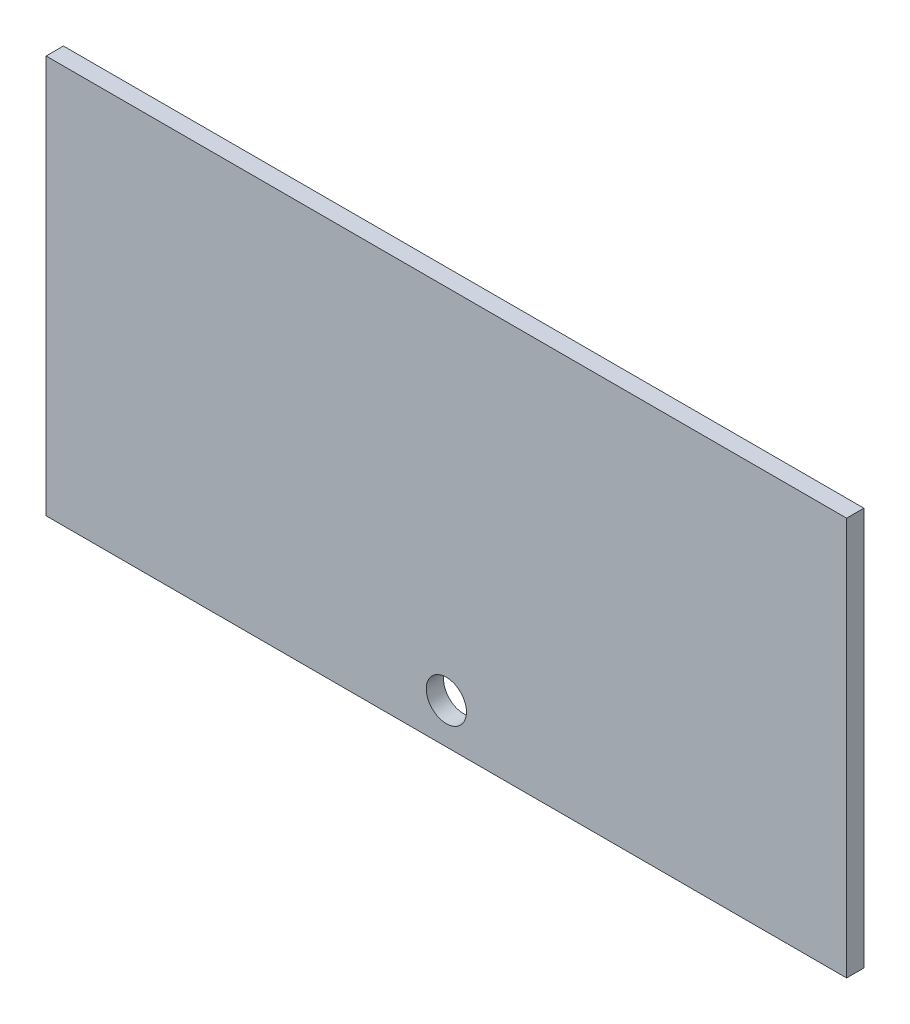
ISO-10303-21;
HEADER;
FILE_DESCRIPTION(('STEP AP214'),'2;1');
FILE_NAME('part.step','',(''),(''),'','','');
FILE_SCHEMA(('AUTOMOTIVE_DESIGN { 1 0 10303 214 1 1 1 1 }'));
ENDSEC;
DATA;
#1=APPLICATION_CONTEXT('core data for automotive mechanical design processes');
#2=APPLICATION_PROTOCOL_DEFINITION('international standard','automotive_design',2000,#1);
#3=PRODUCT_CONTEXT('',#1,'mechanical');
#4=PRODUCT('Part','Part','',(#3));
#5=PRODUCT_RELATED_PRODUCT_CATEGORY('part','',(#4));
#6=PRODUCT_DEFINITION_FORMATION('','',#4);
#7=PRODUCT_DEFINITION_CONTEXT('part definition',#1,'design');
#8=PRODUCT_DEFINITION('design','',#6,#7);
#9=PRODUCT_DEFINITION_SHAPE('','',#8);
#10=(LENGTH_UNIT() NAMED_UNIT(*) SI_UNIT(.MILLI.,.METRE.));
#11=(NAMED_UNIT(*) PLANE_ANGLE_UNIT() SI_UNIT($,.RADIAN.));
#12=(NAMED_UNIT(*) SI_UNIT($,.STERADIAN.) SOLID_ANGLE_UNIT());
#13=UNCERTAINTY_MEASURE_WITH_UNIT(LENGTH_MEASURE(1.E-05),#10,'distance_accuracy_value','');
#14=(GEOMETRIC_REPRESENTATION_CONTEXT(3) GLOBAL_UNCERTAINTY_ASSIGNED_CONTEXT((#13)) GLOBAL_UNIT_ASSIGNED_CONTEXT((#10,
#11,#12)) REPRESENTATION_CONTEXT('',''));
#15=CARTESIAN_POINT('',(0.,0.,0.));
#16=DIRECTION('',(0.,0.,1.));
#17=DIRECTION('',(1.,0.,0.));
#18=AXIS2_PLACEMENT_3D('',#15,#16,#17);
#19=CARTESIAN_POINT('',(0.,0.,0.));
#20=DIRECTION('',(0.,0.,1.));
#21=DIRECTION('',(1.,0.,0.));
#22=AXIS2_PLACEMENT_3D('',#19,#20,#21);
#23=PLANE('',#22);
#24=CARTESIAN_POINT('',(0.,-197.5,0.));
#25=DIRECTION('',(0.,0.,1.));
#26=DIRECTION('',(-1.,0.,0.));
#27=AXIS2_PLACEMENT_3D('',#24,#25,#26);
#28=CIRCLE('',#27,25.);
#29=CARTESIAN_POINT('',(25.,-197.5,0.));
#30=VERTEX_POINT('',#29);
#31=EDGE_CURVE('E71',#30,#30,#28,.T.);
#32=ORIENTED_EDGE('',*,*,#31,.T.);
#33=EDGE_LOOP('',(#32));
#34=FACE_BOUND('',#33,.T.);
#35=DIRECTION('',(1.,0.,0.));
#36=VECTOR('',#35,1.);
#37=CARTESIAN_POINT('',(-497.5,247.5,0.));
#38=LINE('',#37,#36);
#39=CARTESIAN_POINT('',(-497.5,247.5,0.));
#40=VERTEX_POINT('',#39);
#41=CARTESIAN_POINT('',(497.5,247.5,0.));
#42=VERTEX_POINT('',#41);
#43=EDGE_CURVE('E11',#40,#42,#38,.T.);
#44=ORIENTED_EDGE('',*,*,#43,.T.);
#45=DIRECTION('',(0.,-1.,0.));
#46=VECTOR('',#45,1.);
#47=CARTESIAN_POINT('',(497.5,247.5,0.));
#48=LINE('',#47,#46);
#49=CARTESIAN_POINT('',(497.5,-247.5,0.));
#50=VERTEX_POINT('',#49);
#51=EDGE_CURVE('E76',#42,#50,#48,.T.);
#52=ORIENTED_EDGE('',*,*,#51,.T.);
#53=DIRECTION('',(-1.,0.,0.));
#54=VECTOR('',#53,1.);
#55=CARTESIAN_POINT('',(497.5,-247.5,0.));
#56=LINE('',#55,#54);
#57=CARTESIAN_POINT('',(-497.5,-247.5,0.));
#58=VERTEX_POINT('',#57);
#59=EDGE_CURVE('E94',#50,#58,#56,.T.);
#60=ORIENTED_EDGE('',*,*,#59,.T.);
#61=DIRECTION('',(0.,1.,0.));
#62=VECTOR('',#61,1.);
#63=CARTESIAN_POINT('',(-497.5,-247.5,0.));
#64=LINE('',#63,#62);
#65=EDGE_CURVE('E97',#58,#40,#64,.T.);
#66=ORIENTED_EDGE('',*,*,#65,.T.);
#67=EDGE_LOOP('',(#44,#52,#60,#66));
#68=FACE_BOUND('',#67,.T.);
#69=ADVANCED_FACE('F17',(#34,#68),#23,.F.);
#70=CARTESIAN_POINT('',(497.5,247.5,0.));
#71=DIRECTION('',(0.,1.,0.));
#72=DIRECTION('',(1.,0.,0.));
#73=AXIS2_PLACEMENT_3D('',#70,#71,#72);
#74=PLANE('',#73);
#75=ORIENTED_EDGE('',*,*,#43,.F.);
#76=DIRECTION('',(0.,0.,1.));
#77=VECTOR('',#76,1.);
#78=CARTESIAN_POINT('',(-497.5,247.5,0.));
#79=LINE('',#78,#77);
#80=CARTESIAN_POINT('',(-497.5,247.5,21.5));
#81=VERTEX_POINT('',#80);
#82=EDGE_CURVE('E28',#40,#81,#79,.T.);
#83=ORIENTED_EDGE('',*,*,#82,.T.);
#84=DIRECTION('',(-1.,0.,0.));
#85=VECTOR('',#84,1.);
#86=CARTESIAN_POINT('',(497.5,247.5,21.5));
#87=LINE('',#86,#85);
#88=CARTESIAN_POINT('',(497.5,247.5,21.5));
#89=VERTEX_POINT('',#88);
#90=EDGE_CURVE('E21',#89,#81,#87,.T.);
#91=ORIENTED_EDGE('',*,*,#90,.F.);
#92=DIRECTION('',(0.,0.,1.));
#93=VECTOR('',#92,1.);
#94=CARTESIAN_POINT('',(497.5,247.5,0.));
#95=LINE('',#94,#93);
#96=EDGE_CURVE('E85',#42,#89,#95,.T.);
#97=ORIENTED_EDGE('',*,*,#96,.F.);
#98=EDGE_LOOP('',(#75,#83,#91,#97));
#99=FACE_BOUND('',#98,.T.);
#100=ADVANCED_FACE('F142',(#99),#74,.T.);
#101=CARTESIAN_POINT('',(-497.5,247.5,0.));
#102=DIRECTION('',(-1.,0.,0.));
#103=DIRECTION('',(0.,0.,1.));
#104=AXIS2_PLACEMENT_3D('',#101,#102,#103);
#105=PLANE('',#104);
#106=ORIENTED_EDGE('',*,*,#65,.F.);
#107=DIRECTION('',(0.,0.,1.));
#108=VECTOR('',#107,1.);
#109=CARTESIAN_POINT('',(-497.5,-247.5,0.));
#110=LINE('',#109,#108);
#111=CARTESIAN_POINT('',(-497.5,-247.5,21.5));
#112=VERTEX_POINT('',#111);
#113=EDGE_CURVE('E104',#58,#112,#110,.T.);
#114=ORIENTED_EDGE('',*,*,#113,.T.);
#115=DIRECTION('',(0.,-1.,0.));
#116=VECTOR('',#115,1.);
#117=CARTESIAN_POINT('',(-497.5,247.5,21.5));
#118=LINE('',#117,#116);
#119=EDGE_CURVE('E113',#81,#112,#118,.T.);
#120=ORIENTED_EDGE('',*,*,#119,.F.);
#121=ORIENTED_EDGE('',*,*,#82,.F.);
#122=EDGE_LOOP('',(#106,#114,#120,#121));
#123=FACE_BOUND('',#122,.T.);
#124=ADVANCED_FACE('F145',(#123),#105,.T.);
#125=CARTESIAN_POINT('',(-497.5,-247.5,0.));
#126=DIRECTION('',(0.,-1.,0.));
#127=DIRECTION('',(-1.,0.,0.));
#128=AXIS2_PLACEMENT_3D('',#125,#126,#127);
#129=PLANE('',#128);
#130=ORIENTED_EDGE('',*,*,#59,.F.);
#131=DIRECTION('',(0.,0.,1.));
#132=VECTOR('',#131,1.);
#133=CARTESIAN_POINT('',(497.5,-247.5,0.));
#134=LINE('',#133,#132);
#135=CARTESIAN_POINT('',(497.5,-247.5,21.5));
#136=VERTEX_POINT('',#135);
#137=EDGE_CURVE('E91',#50,#136,#134,.T.);
#138=ORIENTED_EDGE('',*,*,#137,.T.);
#139=DIRECTION('',(1.,0.,0.));
#140=VECTOR('',#139,1.);
#141=CARTESIAN_POINT('',(-497.5,-247.5,21.5));
#142=LINE('',#141,#140);
#143=EDGE_CURVE('E110',#112,#136,#142,.T.);
#144=ORIENTED_EDGE('',*,*,#143,.F.);
#145=ORIENTED_EDGE('',*,*,#113,.F.);
#146=EDGE_LOOP('',(#130,#138,#144,#145));
#147=FACE_BOUND('',#146,.T.);
#148=ADVANCED_FACE('F137',(#147),#129,.T.);
#149=CARTESIAN_POINT('',(497.5,-247.5,0.));
#150=DIRECTION('',(1.,0.,0.));
#151=DIRECTION('',(0.,1.,0.));
#152=AXIS2_PLACEMENT_3D('',#149,#150,#151);
#153=PLANE('',#152);
#154=ORIENTED_EDGE('',*,*,#51,.F.);
#155=ORIENTED_EDGE('',*,*,#96,.T.);
#156=DIRECTION('',(0.,1.,0.));
#157=VECTOR('',#156,1.);
#158=CARTESIAN_POINT('',(497.5,-247.5,21.5));
#159=LINE('',#158,#157);
#160=EDGE_CURVE('E101',#136,#89,#159,.T.);
#161=ORIENTED_EDGE('',*,*,#160,.F.);
#162=ORIENTED_EDGE('',*,*,#137,.F.);
#163=EDGE_LOOP('',(#154,#155,#161,#162));
#164=FACE_BOUND('',#163,.T.);
#165=ADVANCED_FACE('F19',(#164),#153,.T.);
#166=CARTESIAN_POINT('',(0.,-197.5,20.));
#167=DIRECTION('',(0.,0.,-1.));
#168=DIRECTION('',(-1.,0.,0.));
#169=AXIS2_PLACEMENT_3D('',#166,#167,#168);
#170=CYLINDRICAL_SURFACE('',#169,25.);
#171=CARTESIAN_POINT('',(0.,-197.5,21.5));
#172=DIRECTION('',(0.,0.,-1.));
#173=DIRECTION('',(-1.,0.,0.));
#174=AXIS2_PLACEMENT_3D('',#171,#172,#173);
#175=CIRCLE('',#174,25.);
#176=CARTESIAN_POINT('',(25.,-197.5,21.5));
#177=VERTEX_POINT('',#176);
#178=EDGE_CURVE('E87',#177,#177,#175,.T.);
#179=ORIENTED_EDGE('',*,*,#178,.F.);
#180=DIRECTION('',(0.,0.,-1.));
#181=VECTOR('',#180,1.);
#182=CARTESIAN_POINT('',(25.,-197.5,20.));
#183=LINE('',#182,#181);
#184=EDGE_CURVE('E77',#177,#30,#183,.T.);
#185=ORIENTED_EDGE('',*,*,#184,.T.);
#186=ORIENTED_EDGE('',*,*,#31,.F.);
#187=ORIENTED_EDGE('',*,*,#184,.F.);
#188=EDGE_LOOP('',(#179,#185,#186,#187));
#189=FACE_BOUND('',#188,.T.);
#190=ADVANCED_FACE('F156',(#189),#170,.F.);
#191=CARTESIAN_POINT('',(0.,0.,21.5));
#192=DIRECTION('',(0.,0.,1.));
#193=DIRECTION('',(1.,0.,0.));
#194=AXIS2_PLACEMENT_3D('',#191,#192,#193);
#195=PLANE('',#194);
#196=ORIENTED_EDGE('',*,*,#178,.T.);
#197=EDGE_LOOP('',(#196));
#198=FACE_BOUND('',#197,.T.);
#199=ORIENTED_EDGE('',*,*,#90,.T.);
#200=ORIENTED_EDGE('',*,*,#119,.T.);
#201=ORIENTED_EDGE('',*,*,#143,.T.);
#202=ORIENTED_EDGE('',*,*,#160,.T.);
#203=EDGE_LOOP('',(#199,#200,#201,#202));
#204=FACE_BOUND('',#203,.T.);
#205=ADVANCED_FACE('F141',(#198,#204),#195,.T.);
#206=CLOSED_SHELL('',(#69,#100,#124,#148,#165,#190,#205));
#207=MANIFOLD_SOLID_BREP('B1',#206);
#208=ADVANCED_BREP_SHAPE_REPRESENTATION('',(#18,#207),#14);
#209=SHAPE_DEFINITION_REPRESENTATION(#9,#208);
ENDSEC;
END-ISO-10303-21;
